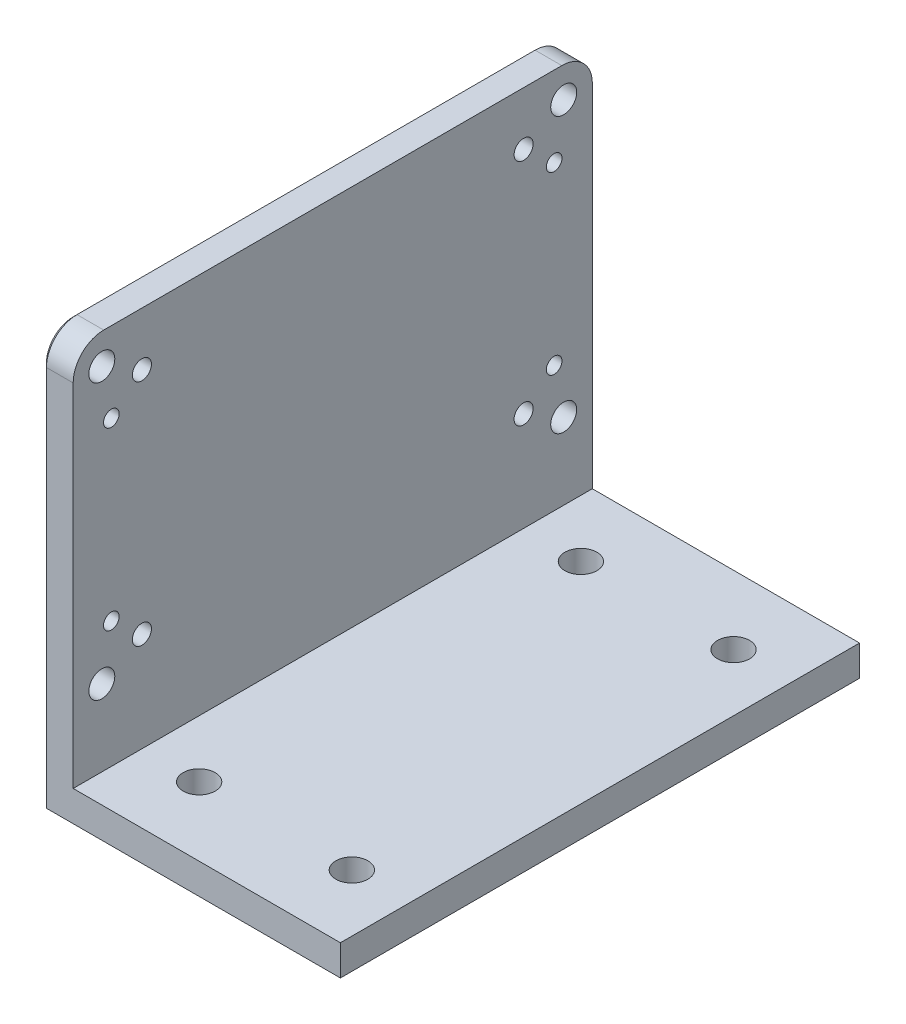
ISO-10303-21;
HEADER;
FILE_DESCRIPTION(('STEP AP214'),'2;1');
FILE_NAME('part.step','',(''),(''),'','','');
FILE_SCHEMA(('AUTOMOTIVE_DESIGN { 1 0 10303 214 1 1 1 1 }'));
ENDSEC;
DATA;
#1=APPLICATION_CONTEXT('core data for automotive mechanical design processes');
#2=APPLICATION_PROTOCOL_DEFINITION('international standard','automotive_design',2000,#1);
#3=PRODUCT_CONTEXT('',#1,'mechanical');
#4=PRODUCT('Part','Part','',(#3));
#5=PRODUCT_RELATED_PRODUCT_CATEGORY('part','',(#4));
#6=PRODUCT_DEFINITION_FORMATION('','',#4);
#7=PRODUCT_DEFINITION_CONTEXT('part definition',#1,'design');
#8=PRODUCT_DEFINITION('design','',#6,#7);
#9=PRODUCT_DEFINITION_SHAPE('','',#8);
#10=(LENGTH_UNIT() NAMED_UNIT(*) SI_UNIT(.MILLI.,.METRE.));
#11=(NAMED_UNIT(*) PLANE_ANGLE_UNIT() SI_UNIT($,.RADIAN.));
#12=(NAMED_UNIT(*) SI_UNIT($,.STERADIAN.) SOLID_ANGLE_UNIT());
#13=UNCERTAINTY_MEASURE_WITH_UNIT(LENGTH_MEASURE(1.E-05),#10,'distance_accuracy_value','');
#14=(GEOMETRIC_REPRESENTATION_CONTEXT(3) GLOBAL_UNCERTAINTY_ASSIGNED_CONTEXT((#13)) GLOBAL_UNIT_ASSIGNED_CONTEXT((#10,
#11,#12)) REPRESENTATION_CONTEXT('',''));
#15=CARTESIAN_POINT('',(0.,0.,0.));
#16=DIRECTION('',(0.,0.,1.));
#17=DIRECTION('',(1.,0.,0.));
#18=AXIS2_PLACEMENT_3D('',#15,#16,#17);
#19=CARTESIAN_POINT('',(0.,54.,68.));
#20=DIRECTION('',(1.,0.,0.));
#21=DIRECTION('',(0.,1.,0.));
#22=AXIS2_PLACEMENT_3D('',#19,#20,#21);
#23=PLANE('',#22);
#24=CARTESIAN_POINT('',(0.,17.,9.00000000000001));
#25=DIRECTION('',(-1.,0.,0.));
#26=DIRECTION('',(0.,0.,1.));
#27=AXIS2_PLACEMENT_3D('',#24,#25,#26);
#28=CIRCLE('',#27,1.25);
#29=CARTESIAN_POINT('',(0.,17.,10.25));
#30=VERTEX_POINT('',#29);
#31=EDGE_CURVE('E659',#30,#30,#28,.T.);
#32=ORIENTED_EDGE('',*,*,#31,.F.);
#33=EDGE_LOOP('',(#32));
#34=FACE_BOUND('',#33,.T.);
#35=CARTESIAN_POINT('',(0.,47.,9.00000000000001));
#36=DIRECTION('',(-1.,0.,0.));
#37=DIRECTION('',(0.,0.,1.));
#38=AXIS2_PLACEMENT_3D('',#35,#36,#37);
#39=CIRCLE('',#38,1.25);
#40=CARTESIAN_POINT('',(0.,47.,10.25));
#41=VERTEX_POINT('',#40);
#42=EDGE_CURVE('E663',#41,#41,#39,.T.);
#43=ORIENTED_EDGE('',*,*,#42,.F.);
#44=EDGE_LOOP('',(#43));
#45=FACE_BOUND('',#44,.T.);
#46=CARTESIAN_POINT('',(0.,47.,59.));
#47=DIRECTION('',(-1.,0.,0.));
#48=DIRECTION('',(0.,0.,1.));
#49=AXIS2_PLACEMENT_3D('',#46,#47,#48);
#50=CIRCLE('',#49,1.25);
#51=CARTESIAN_POINT('',(0.,47.,60.25));
#52=VERTEX_POINT('',#51);
#53=EDGE_CURVE('E227',#52,#52,#50,.T.);
#54=ORIENTED_EDGE('',*,*,#53,.F.);
#55=EDGE_LOOP('',(#54));
#56=FACE_BOUND('',#55,.T.);
#57=CARTESIAN_POINT('',(0.,17.,59.));
#58=DIRECTION('',(-1.,0.,0.));
#59=DIRECTION('',(0.,0.,1.));
#60=AXIS2_PLACEMENT_3D('',#57,#58,#59);
#61=CIRCLE('',#60,1.25);
#62=CARTESIAN_POINT('',(0.,17.,60.25));
#63=VERTEX_POINT('',#62);
#64=EDGE_CURVE('E216',#63,#63,#61,.T.);
#65=ORIENTED_EDGE('',*,*,#64,.F.);
#66=EDGE_LOOP('',(#65));
#67=FACE_BOUND('',#66,.T.);
#68=CARTESIAN_POINT('',(0.,43.5,5.00000000000001));
#69=DIRECTION('',(-1.,0.,0.));
#70=DIRECTION('',(0.,0.,1.));
#71=AXIS2_PLACEMENT_3D('',#68,#69,#70);
#72=CIRCLE('',#71,1.025);
#73=CARTESIAN_POINT('',(0.,43.5,6.02500000000001));
#74=VERTEX_POINT('',#73);
#75=EDGE_CURVE('E215',#74,#74,#72,.T.);
#76=ORIENTED_EDGE('',*,*,#75,.F.);
#77=EDGE_LOOP('',(#76));
#78=FACE_BOUND('',#77,.T.);
#79=CARTESIAN_POINT('',(0.,43.5,63.));
#80=DIRECTION('',(-1.,0.,0.));
#81=DIRECTION('',(0.,0.,1.));
#82=AXIS2_PLACEMENT_3D('',#79,#80,#81);
#83=CIRCLE('',#82,1.025);
#84=CARTESIAN_POINT('',(0.,43.5,64.025));
#85=VERTEX_POINT('',#84);
#86=EDGE_CURVE('E233',#85,#85,#83,.T.);
#87=ORIENTED_EDGE('',*,*,#86,.F.);
#88=EDGE_LOOP('',(#87));
#89=FACE_BOUND('',#88,.T.);
#90=CARTESIAN_POINT('',(0.,20.5,63.));
#91=DIRECTION('',(-1.,0.,0.));
#92=DIRECTION('',(0.,0.,1.));
#93=AXIS2_PLACEMENT_3D('',#90,#91,#92);
#94=CIRCLE('',#93,1.025);
#95=CARTESIAN_POINT('',(0.,20.5,64.025));
#96=VERTEX_POINT('',#95);
#97=EDGE_CURVE('E239',#96,#96,#94,.T.);
#98=ORIENTED_EDGE('',*,*,#97,.F.);
#99=EDGE_LOOP('',(#98));
#100=FACE_BOUND('',#99,.T.);
#101=CARTESIAN_POINT('',(0.,20.5,5.00000000000001));
#102=DIRECTION('',(-1.,0.,0.));
#103=DIRECTION('',(0.,0.,1.));
#104=AXIS2_PLACEMENT_3D('',#101,#102,#103);
#105=CIRCLE('',#104,1.025);
#106=CARTESIAN_POINT('',(0.,20.5,6.02500000000001));
#107=VERTEX_POINT('',#106);
#108=EDGE_CURVE('E245',#107,#107,#105,.T.);
#109=ORIENTED_EDGE('',*,*,#108,.F.);
#110=EDGE_LOOP('',(#109));
#111=FACE_BOUND('',#110,.T.);
#112=CARTESIAN_POINT('',(0.,50.,64.25));
#113=DIRECTION('',(1.,0.,0.));
#114=DIRECTION('',(0.,1.,0.));
#115=AXIS2_PLACEMENT_3D('',#112,#113,#114);
#116=CIRCLE('',#115,1.7);
#117=CARTESIAN_POINT('',(0.,51.7,64.25));
#118=VERTEX_POINT('',#117);
#119=EDGE_CURVE('E276',#118,#118,#116,.T.);
#120=ORIENTED_EDGE('',*,*,#119,.T.);
#121=EDGE_LOOP('',(#120));
#122=FACE_BOUND('',#121,.T.);
#123=CARTESIAN_POINT('',(0.,50.,3.75));
#124=DIRECTION('',(1.,0.,0.));
#125=DIRECTION('',(0.,1.,0.));
#126=AXIS2_PLACEMENT_3D('',#123,#124,#125);
#127=CIRCLE('',#126,1.7);
#128=CARTESIAN_POINT('',(0.,51.7,3.75));
#129=VERTEX_POINT('',#128);
#130=EDGE_CURVE('E282',#129,#129,#127,.T.);
#131=ORIENTED_EDGE('',*,*,#130,.T.);
#132=EDGE_LOOP('',(#131));
#133=FACE_BOUND('',#132,.T.);
#134=CARTESIAN_POINT('',(0.,14.,3.75));
#135=DIRECTION('',(1.,0.,0.));
#136=DIRECTION('',(0.,1.,0.));
#137=AXIS2_PLACEMENT_3D('',#134,#135,#136);
#138=CIRCLE('',#137,1.7);
#139=CARTESIAN_POINT('',(0.,15.7,3.75));
#140=VERTEX_POINT('',#139);
#141=EDGE_CURVE('E288',#140,#140,#138,.T.);
#142=ORIENTED_EDGE('',*,*,#141,.T.);
#143=EDGE_LOOP('',(#142));
#144=FACE_BOUND('',#143,.T.);
#145=CARTESIAN_POINT('',(0.,14.,64.25));
#146=DIRECTION('',(1.,0.,0.));
#147=DIRECTION('',(0.,1.,0.));
#148=AXIS2_PLACEMENT_3D('',#145,#146,#147);
#149=CIRCLE('',#148,1.7);
#150=CARTESIAN_POINT('',(0.,15.7,64.25));
#151=VERTEX_POINT('',#150);
#152=EDGE_CURVE('E154',#151,#151,#149,.T.);
#153=ORIENTED_EDGE('',*,*,#152,.T.);
#154=EDGE_LOOP('',(#153));
#155=FACE_BOUND('',#154,.T.);
#156=DIRECTION('',(0.,0.,-1.));
#157=VECTOR('',#156,1.);
#158=CARTESIAN_POINT('',(0.,0.,68.));
#159=LINE('',#158,#157);
#160=CARTESIAN_POINT('',(0.,0.,67.5));
#161=VERTEX_POINT('',#160);
#162=CARTESIAN_POINT('',(0.,0.,0.499999999999994));
#163=VERTEX_POINT('',#162);
#164=EDGE_CURVE('E137',#161,#163,#159,.T.);
#165=ORIENTED_EDGE('',*,*,#164,.F.);
#166=DIRECTION('',(0.,1.,0.));
#167=VECTOR('',#166,1.);
#168=CARTESIAN_POINT('',(0.,50.,67.5));
#169=LINE('',#168,#167);
#170=CARTESIAN_POINT('',(0.,50.,67.5));
#171=VERTEX_POINT('',#170);
#172=EDGE_CURVE('E193',#161,#171,#169,.T.);
#173=ORIENTED_EDGE('',*,*,#172,.T.);
#174=CARTESIAN_POINT('',(0.,50.,64.));
#175=DIRECTION('',(1.,0.,0.));
#176=DIRECTION('',(0.,1.,0.));
#177=AXIS2_PLACEMENT_3D('',#174,#175,#176);
#178=CIRCLE('',#177,3.50000000000003);
#179=CARTESIAN_POINT('',(0.,53.5,64.));
#180=VERTEX_POINT('',#179);
#181=EDGE_CURVE('E191',#171,#180,#178,.F.);
#182=ORIENTED_EDGE('',*,*,#181,.T.);
#183=DIRECTION('',(0.,0.,-1.));
#184=VECTOR('',#183,1.);
#185=CARTESIAN_POINT('',(0.,53.5,68.));
#186=LINE('',#185,#184);
#187=CARTESIAN_POINT('',(0.,53.5,4.));
#188=VERTEX_POINT('',#187);
#189=EDGE_CURVE('E189',#180,#188,#186,.T.);
#190=ORIENTED_EDGE('',*,*,#189,.T.);
#191=CARTESIAN_POINT('',(0.,50.,4.));
#192=DIRECTION('',(1.,0.,0.));
#193=DIRECTION('',(0.,1.,0.));
#194=AXIS2_PLACEMENT_3D('',#191,#192,#193);
#195=CIRCLE('',#194,3.50000000000003);
#196=CARTESIAN_POINT('',(0.,50.,0.499999999999973));
#197=VERTEX_POINT('',#196);
#198=EDGE_CURVE('E187',#188,#197,#195,.F.);
#199=ORIENTED_EDGE('',*,*,#198,.T.);
#200=DIRECTION('',(0.,-1.,0.));
#201=VECTOR('',#200,1.);
#202=CARTESIAN_POINT('',(0.,54.,0.499999999999973));
#203=LINE('',#202,#201);
#204=EDGE_CURVE('E185',#197,#163,#203,.T.);
#205=ORIENTED_EDGE('',*,*,#204,.T.);
#206=EDGE_LOOP('',(#165,#173,#182,#190,#199,#205));
#207=FACE_BOUND('',#206,.T.);
#208=ADVANCED_FACE('F35',(#34,#45,#56,#67,#78,#89,#100,#111,#122,#133,#144,#155,#207),#23,.F.);
#209=CARTESIAN_POINT('',(0.,0.,68.));
#210=DIRECTION('',(0.,1.,0.));
#211=DIRECTION('',(0.,0.,1.));
#212=AXIS2_PLACEMENT_3D('',#209,#210,#211);
#213=PLANE('',#212);
#214=CARTESIAN_POINT('',(31.5,0.,59.));
#215=DIRECTION('',(0.,1.,0.));
#216=DIRECTION('',(0.,0.,1.));
#217=AXIS2_PLACEMENT_3D('',#214,#215,#216);
#218=CIRCLE('',#217,2.1);
#219=CARTESIAN_POINT('',(31.5,0.,61.1));
#220=VERTEX_POINT('',#219);
#221=EDGE_CURVE('E252',#220,#220,#218,.T.);
#222=ORIENTED_EDGE('',*,*,#221,.T.);
#223=EDGE_LOOP('',(#222));
#224=FACE_BOUND('',#223,.T.);
#225=CARTESIAN_POINT('',(11.5,0.,59.));
#226=DIRECTION('',(0.,1.,0.));
#227=DIRECTION('',(0.,0.,1.));
#228=AXIS2_PLACEMENT_3D('',#225,#226,#227);
#229=CIRCLE('',#228,2.1);
#230=CARTESIAN_POINT('',(11.5,0.,61.1));
#231=VERTEX_POINT('',#230);
#232=EDGE_CURVE('E258',#231,#231,#229,.T.);
#233=ORIENTED_EDGE('',*,*,#232,.T.);
#234=EDGE_LOOP('',(#233));
#235=FACE_BOUND('',#234,.T.);
#236=CARTESIAN_POINT('',(11.5,0.,9.));
#237=DIRECTION('',(0.,1.,0.));
#238=DIRECTION('',(0.,0.,1.));
#239=AXIS2_PLACEMENT_3D('',#236,#237,#238);
#240=CIRCLE('',#239,2.1);
#241=CARTESIAN_POINT('',(11.5,0.,11.1));
#242=VERTEX_POINT('',#241);
#243=EDGE_CURVE('E264',#242,#242,#240,.T.);
#244=ORIENTED_EDGE('',*,*,#243,.T.);
#245=EDGE_LOOP('',(#244));
#246=FACE_BOUND('',#245,.T.);
#247=CARTESIAN_POINT('',(31.5,0.,9.));
#248=DIRECTION('',(0.,1.,0.));
#249=DIRECTION('',(0.,0.,1.));
#250=AXIS2_PLACEMENT_3D('',#247,#248,#249);
#251=CIRCLE('',#250,2.1);
#252=CARTESIAN_POINT('',(31.5,0.,11.1));
#253=VERTEX_POINT('',#252);
#254=EDGE_CURVE('E270',#253,#253,#251,.T.);
#255=ORIENTED_EDGE('',*,*,#254,.T.);
#256=EDGE_LOOP('',(#255));
#257=FACE_BOUND('',#256,.T.);
#258=DIRECTION('',(1.,0.,0.));
#259=VECTOR('',#258,1.);
#260=CARTESIAN_POINT('',(0.,0.,68.));
#261=LINE('',#260,#259);
#262=CARTESIAN_POINT('',(0.499999999999973,0.,68.));
#263=VERTEX_POINT('',#262);
#264=CARTESIAN_POINT('',(39.,0.,68.));
#265=VERTEX_POINT('',#264);
#266=EDGE_CURVE('E119',#263,#265,#261,.T.);
#267=ORIENTED_EDGE('',*,*,#266,.F.);
#268=DIRECTION('',(-0.707106781186548,0.,-0.707106781186548));
#269=VECTOR('',#268,1.);
#270=CARTESIAN_POINT('',(0.499999999999973,0.,68.));
#271=LINE('',#270,#269);
#272=EDGE_CURVE('E183',#263,#161,#271,.T.);
#273=ORIENTED_EDGE('',*,*,#272,.T.);
#274=ORIENTED_EDGE('',*,*,#164,.T.);
#275=DIRECTION('',(-0.707106781186548,0.,0.707106781186548));
#276=VECTOR('',#275,1.);
#277=CARTESIAN_POINT('',(0.,0.,0.499999999999981));
#278=LINE('',#277,#276);
#279=CARTESIAN_POINT('',(0.499999999999973,0.,0.));
#280=VERTEX_POINT('',#279);
#281=EDGE_CURVE('E181',#163,#280,#278,.F.);
#282=ORIENTED_EDGE('',*,*,#281,.T.);
#283=DIRECTION('',(1.,0.,0.));
#284=VECTOR('',#283,1.);
#285=CARTESIAN_POINT('',(0.,0.,0.));
#286=LINE('',#285,#284);
#287=CARTESIAN_POINT('',(39.,0.,0.));
#288=VERTEX_POINT('',#287);
#289=EDGE_CURVE('E134',#280,#288,#286,.T.);
#290=ORIENTED_EDGE('',*,*,#289,.T.);
#291=DIRECTION('',(0.,0.,-1.));
#292=VECTOR('',#291,1.);
#293=CARTESIAN_POINT('',(39.,0.,68.));
#294=LINE('',#293,#292);
#295=EDGE_CURVE('E132',#265,#288,#294,.T.);
#296=ORIENTED_EDGE('',*,*,#295,.F.);
#297=EDGE_LOOP('',(#267,#273,#274,#282,#290,#296));
#298=FACE_BOUND('',#297,.T.);
#299=ADVANCED_FACE('F133',(#224,#235,#246,#257,#298),#213,.F.);
#300=CARTESIAN_POINT('',(39.,0.,68.));
#301=DIRECTION('',(-1.,0.,0.));
#302=DIRECTION('',(0.,0.,1.));
#303=AXIS2_PLACEMENT_3D('',#300,#301,#302);
#304=PLANE('',#303);
#305=DIRECTION('',(0.,1.,0.));
#306=VECTOR('',#305,1.);
#307=CARTESIAN_POINT('',(39.,0.,0.));
#308=LINE('',#307,#306);
#309=CARTESIAN_POINT('',(39.,3.99999999999999,0.));
#310=VERTEX_POINT('',#309);
#311=EDGE_CURVE('E153',#288,#310,#308,.T.);
#312=ORIENTED_EDGE('',*,*,#311,.T.);
#313=DIRECTION('',(0.,0.,-1.));
#314=VECTOR('',#313,1.);
#315=CARTESIAN_POINT('',(39.,3.99999999999999,68.));
#316=LINE('',#315,#314);
#317=CARTESIAN_POINT('',(39.,3.99999999999999,68.));
#318=VERTEX_POINT('',#317);
#319=EDGE_CURVE('E138',#318,#310,#316,.T.);
#320=ORIENTED_EDGE('',*,*,#319,.F.);
#321=DIRECTION('',(0.,1.,0.));
#322=VECTOR('',#321,1.);
#323=CARTESIAN_POINT('',(39.,0.,68.));
#324=LINE('',#323,#322);
#325=EDGE_CURVE('E124',#265,#318,#324,.T.);
#326=ORIENTED_EDGE('',*,*,#325,.F.);
#327=ORIENTED_EDGE('',*,*,#295,.T.);
#328=EDGE_LOOP('',(#312,#320,#326,#327));
#329=FACE_BOUND('',#328,.T.);
#330=ADVANCED_FACE('F140',(#329),#304,.F.);
#331=CARTESIAN_POINT('',(39.,3.99999999999999,68.));
#332=DIRECTION('',(0.,-1.,0.));
#333=DIRECTION('',(1.,0.,0.));
#334=AXIS2_PLACEMENT_3D('',#331,#332,#333);
#335=PLANE('',#334);
#336=CARTESIAN_POINT('',(31.5,3.99999999999999,59.));
#337=DIRECTION('',(0.,1.,0.));
#338=DIRECTION('',(0.,0.,1.));
#339=AXIS2_PLACEMENT_3D('',#336,#337,#338);
#340=CIRCLE('',#339,2.1);
#341=CARTESIAN_POINT('',(31.5,3.99999999999999,61.1));
#342=VERTEX_POINT('',#341);
#343=EDGE_CURVE('E212',#342,#342,#340,.T.);
#344=ORIENTED_EDGE('',*,*,#343,.F.);
#345=EDGE_LOOP('',(#344));
#346=FACE_BOUND('',#345,.T.);
#347=CARTESIAN_POINT('',(11.5,3.99999999999999,59.));
#348=DIRECTION('',(0.,1.,0.));
#349=DIRECTION('',(0.,0.,1.));
#350=AXIS2_PLACEMENT_3D('',#347,#348,#349);
#351=CIRCLE('',#350,2.1);
#352=CARTESIAN_POINT('',(11.5,3.99999999999999,61.1));
#353=VERTEX_POINT('',#352);
#354=EDGE_CURVE('E255',#353,#353,#351,.T.);
#355=ORIENTED_EDGE('',*,*,#354,.F.);
#356=EDGE_LOOP('',(#355));
#357=FACE_BOUND('',#356,.T.);
#358=CARTESIAN_POINT('',(11.5,3.99999999999999,9.));
#359=DIRECTION('',(0.,1.,0.));
#360=DIRECTION('',(0.,0.,1.));
#361=AXIS2_PLACEMENT_3D('',#358,#359,#360);
#362=CIRCLE('',#361,2.1);
#363=CARTESIAN_POINT('',(11.5,3.99999999999999,11.1));
#364=VERTEX_POINT('',#363);
#365=EDGE_CURVE('E261',#364,#364,#362,.T.);
#366=ORIENTED_EDGE('',*,*,#365,.F.);
#367=EDGE_LOOP('',(#366));
#368=FACE_BOUND('',#367,.T.);
#369=CARTESIAN_POINT('',(31.5,3.99999999999999,9.));
#370=DIRECTION('',(0.,1.,0.));
#371=DIRECTION('',(0.,0.,1.));
#372=AXIS2_PLACEMENT_3D('',#369,#370,#371);
#373=CIRCLE('',#372,2.1);
#374=CARTESIAN_POINT('',(31.5,3.99999999999999,11.1));
#375=VERTEX_POINT('',#374);
#376=EDGE_CURVE('E267',#375,#375,#373,.T.);
#377=ORIENTED_EDGE('',*,*,#376,.F.);
#378=EDGE_LOOP('',(#377));
#379=FACE_BOUND('',#378,.T.);
#380=DIRECTION('',(-1.,0.,0.));
#381=VECTOR('',#380,1.);
#382=CARTESIAN_POINT('',(39.,3.99999999999999,0.));
#383=LINE('',#382,#381);
#384=CARTESIAN_POINT('',(3.99999999999999,3.99999999999999,0.));
#385=VERTEX_POINT('',#384);
#386=EDGE_CURVE('E156',#310,#385,#383,.T.);
#387=ORIENTED_EDGE('',*,*,#386,.T.);
#388=DIRECTION('',(0.,0.,-1.));
#389=VECTOR('',#388,1.);
#390=CARTESIAN_POINT('',(3.99999999999999,3.99999999999999,68.));
#391=LINE('',#390,#389);
#392=CARTESIAN_POINT('',(3.99999999999999,3.99999999999999,68.));
#393=VERTEX_POINT('',#392);
#394=EDGE_CURVE('E162',#393,#385,#391,.T.);
#395=ORIENTED_EDGE('',*,*,#394,.F.);
#396=DIRECTION('',(-1.,0.,0.));
#397=VECTOR('',#396,1.);
#398=CARTESIAN_POINT('',(39.,3.99999999999999,68.));
#399=LINE('',#398,#397);
#400=EDGE_CURVE('E143',#318,#393,#399,.T.);
#401=ORIENTED_EDGE('',*,*,#400,.F.);
#402=ORIENTED_EDGE('',*,*,#319,.T.);
#403=EDGE_LOOP('',(#387,#395,#401,#402));
#404=FACE_BOUND('',#403,.T.);
#405=ADVANCED_FACE('F376',(#346,#357,#368,#379,#404),#335,.F.);
#406=CARTESIAN_POINT('',(3.99999999999999,3.99999999999999,68.));
#407=DIRECTION('',(-1.,0.,0.));
#408=DIRECTION('',(0.,-1.,0.));
#409=AXIS2_PLACEMENT_3D('',#406,#407,#408);
#410=PLANE('',#409);
#411=CARTESIAN_POINT('',(3.99999999999999,17.,9.00000000000001));
#412=DIRECTION('',(-1.,0.,0.));
#413=DIRECTION('',(0.,-1.,0.));
#414=AXIS2_PLACEMENT_3D('',#411,#412,#413);
#415=CIRCLE('',#414,1.25);
#416=CARTESIAN_POINT('',(3.99999999999999,15.75,9.00000000000001));
#417=VERTEX_POINT('',#416);
#418=EDGE_CURVE('E662',#417,#417,#415,.T.);
#419=ORIENTED_EDGE('',*,*,#418,.T.);
#420=EDGE_LOOP('',(#419));
#421=FACE_BOUND('',#420,.T.);
#422=CARTESIAN_POINT('',(3.99999999999999,47.,9.00000000000001));
#423=DIRECTION('',(-1.,0.,0.));
#424=DIRECTION('',(0.,-1.,0.));
#425=AXIS2_PLACEMENT_3D('',#422,#423,#424);
#426=CIRCLE('',#425,1.25);
#427=CARTESIAN_POINT('',(3.99999999999999,45.75,9.00000000000001));
#428=VERTEX_POINT('',#427);
#429=EDGE_CURVE('E666',#428,#428,#426,.T.);
#430=ORIENTED_EDGE('',*,*,#429,.T.);
#431=EDGE_LOOP('',(#430));
#432=FACE_BOUND('',#431,.T.);
#433=CARTESIAN_POINT('',(3.99999999999999,47.,59.));
#434=DIRECTION('',(-1.,0.,0.));
#435=DIRECTION('',(0.,-1.,0.));
#436=AXIS2_PLACEMENT_3D('',#433,#434,#435);
#437=CIRCLE('',#436,1.25);
#438=CARTESIAN_POINT('',(3.99999999999999,45.75,59.));
#439=VERTEX_POINT('',#438);
#440=EDGE_CURVE('E39',#439,#439,#437,.T.);
#441=ORIENTED_EDGE('',*,*,#440,.T.);
#442=EDGE_LOOP('',(#441));
#443=FACE_BOUND('',#442,.T.);
#444=CARTESIAN_POINT('',(3.99999999999999,17.,59.));
#445=DIRECTION('',(-1.,0.,0.));
#446=DIRECTION('',(0.,-1.,0.));
#447=AXIS2_PLACEMENT_3D('',#444,#445,#446);
#448=CIRCLE('',#447,1.25);
#449=CARTESIAN_POINT('',(3.99999999999999,15.75,59.));
#450=VERTEX_POINT('',#449);
#451=EDGE_CURVE('E213',#450,#450,#448,.T.);
#452=ORIENTED_EDGE('',*,*,#451,.T.);
#453=EDGE_LOOP('',(#452));
#454=FACE_BOUND('',#453,.T.);
#455=CARTESIAN_POINT('',(3.99999999999999,43.5,5.00000000000001));
#456=DIRECTION('',(-1.,0.,0.));
#457=DIRECTION('',(0.,-1.,0.));
#458=AXIS2_PLACEMENT_3D('',#455,#456,#457);
#459=CIRCLE('',#458,1.025);
#460=CARTESIAN_POINT('',(3.99999999999999,42.475,5.00000000000001));
#461=VERTEX_POINT('',#460);
#462=EDGE_CURVE('E220',#461,#461,#459,.T.);
#463=ORIENTED_EDGE('',*,*,#462,.T.);
#464=EDGE_LOOP('',(#463));
#465=FACE_BOUND('',#464,.T.);
#466=CARTESIAN_POINT('',(3.99999999999999,43.5,63.));
#467=DIRECTION('',(-1.,0.,0.));
#468=DIRECTION('',(0.,-1.,0.));
#469=AXIS2_PLACEMENT_3D('',#466,#467,#468);
#470=CIRCLE('',#469,1.025);
#471=CARTESIAN_POINT('',(3.99999999999999,42.475,63.));
#472=VERTEX_POINT('',#471);
#473=EDGE_CURVE('E236',#472,#472,#470,.T.);
#474=ORIENTED_EDGE('',*,*,#473,.T.);
#475=EDGE_LOOP('',(#474));
#476=FACE_BOUND('',#475,.T.);
#477=CARTESIAN_POINT('',(3.99999999999999,20.5,63.));
#478=DIRECTION('',(-1.,0.,0.));
#479=DIRECTION('',(0.,-1.,0.));
#480=AXIS2_PLACEMENT_3D('',#477,#478,#479);
#481=CIRCLE('',#480,1.025);
#482=CARTESIAN_POINT('',(3.99999999999999,19.475,63.));
#483=VERTEX_POINT('',#482);
#484=EDGE_CURVE('E242',#483,#483,#481,.T.);
#485=ORIENTED_EDGE('',*,*,#484,.T.);
#486=EDGE_LOOP('',(#485));
#487=FACE_BOUND('',#486,.T.);
#488=CARTESIAN_POINT('',(3.99999999999999,20.5,5.00000000000001));
#489=DIRECTION('',(-1.,0.,0.));
#490=DIRECTION('',(0.,-1.,0.));
#491=AXIS2_PLACEMENT_3D('',#488,#489,#490);
#492=CIRCLE('',#491,1.025);
#493=CARTESIAN_POINT('',(3.99999999999999,19.475,5.00000000000001));
#494=VERTEX_POINT('',#493);
#495=EDGE_CURVE('E204',#494,#494,#492,.T.);
#496=ORIENTED_EDGE('',*,*,#495,.T.);
#497=EDGE_LOOP('',(#496));
#498=FACE_BOUND('',#497,.T.);
#499=CARTESIAN_POINT('',(3.99999999999998,50.,64.25));
#500=DIRECTION('',(1.,0.,0.));
#501=DIRECTION('',(0.,0.,-1.));
#502=AXIS2_PLACEMENT_3D('',#499,#500,#501);
#503=CIRCLE('',#502,1.7);
#504=CARTESIAN_POINT('',(3.99999999999998,50.,62.55));
#505=VERTEX_POINT('',#504);
#506=EDGE_CURVE('E273',#505,#505,#503,.T.);
#507=ORIENTED_EDGE('',*,*,#506,.F.);
#508=EDGE_LOOP('',(#507));
#509=FACE_BOUND('',#508,.T.);
#510=CARTESIAN_POINT('',(3.99999999999998,50.,3.75));
#511=DIRECTION('',(1.,0.,0.));
#512=DIRECTION('',(0.,0.,-1.));
#513=AXIS2_PLACEMENT_3D('',#510,#511,#512);
#514=CIRCLE('',#513,1.7);
#515=CARTESIAN_POINT('',(3.99999999999998,50.,2.05));
#516=VERTEX_POINT('',#515);
#517=EDGE_CURVE('E279',#516,#516,#514,.T.);
#518=ORIENTED_EDGE('',*,*,#517,.F.);
#519=EDGE_LOOP('',(#518));
#520=FACE_BOUND('',#519,.T.);
#521=CARTESIAN_POINT('',(3.99999999999999,14.,3.75));
#522=DIRECTION('',(1.,0.,0.));
#523=DIRECTION('',(0.,0.,-1.));
#524=AXIS2_PLACEMENT_3D('',#521,#522,#523);
#525=CIRCLE('',#524,1.7);
#526=CARTESIAN_POINT('',(3.99999999999999,14.,2.05));
#527=VERTEX_POINT('',#526);
#528=EDGE_CURVE('E285',#527,#527,#525,.T.);
#529=ORIENTED_EDGE('',*,*,#528,.F.);
#530=EDGE_LOOP('',(#529));
#531=FACE_BOUND('',#530,.T.);
#532=CARTESIAN_POINT('',(3.99999999999999,14.,64.25));
#533=DIRECTION('',(1.,0.,0.));
#534=DIRECTION('',(0.,0.,-1.));
#535=AXIS2_PLACEMENT_3D('',#532,#533,#534);
#536=CIRCLE('',#535,1.7);
#537=CARTESIAN_POINT('',(3.99999999999999,14.,62.55));
#538=VERTEX_POINT('',#537);
#539=EDGE_CURVE('E291',#538,#538,#536,.T.);
#540=ORIENTED_EDGE('',*,*,#539,.F.);
#541=EDGE_LOOP('',(#540));
#542=FACE_BOUND('',#541,.T.);
#543=DIRECTION('',(0.,0.,-1.));
#544=VECTOR('',#543,1.);
#545=CARTESIAN_POINT('',(3.99999999999998,54.,68.));
#546=LINE('',#545,#544);
#547=CARTESIAN_POINT('',(3.99999999999998,54.,64.));
#548=VERTEX_POINT('',#547);
#549=CARTESIAN_POINT('',(3.99999999999998,54.,4.));
#550=VERTEX_POINT('',#549);
#551=EDGE_CURVE('E151',#548,#550,#546,.T.);
#552=ORIENTED_EDGE('',*,*,#551,.F.);
#553=CARTESIAN_POINT('',(3.99999999999998,50.,64.));
#554=DIRECTION('',(-1.,0.,0.));
#555=DIRECTION('',(0.,-1.,0.));
#556=AXIS2_PLACEMENT_3D('',#553,#554,#555);
#557=CIRCLE('',#556,4.);
#558=CARTESIAN_POINT('',(3.99999999999998,50.,68.));
#559=VERTEX_POINT('',#558);
#560=EDGE_CURVE('E176',#548,#559,#557,.F.);
#561=ORIENTED_EDGE('',*,*,#560,.T.);
#562=DIRECTION('',(0.,1.,0.));
#563=VECTOR('',#562,1.);
#564=CARTESIAN_POINT('',(3.99999999999999,3.99999999999999,68.));
#565=LINE('',#564,#563);
#566=EDGE_CURVE('E145',#393,#559,#565,.T.);
#567=ORIENTED_EDGE('',*,*,#566,.F.);
#568=ORIENTED_EDGE('',*,*,#394,.T.);
#569=DIRECTION('',(0.,1.,0.));
#570=VECTOR('',#569,1.);
#571=CARTESIAN_POINT('',(3.99999999999999,3.99999999999999,0.));
#572=LINE('',#571,#570);
#573=CARTESIAN_POINT('',(3.99999999999998,50.,0.));
#574=VERTEX_POINT('',#573);
#575=EDGE_CURVE('E129',#385,#574,#572,.T.);
#576=ORIENTED_EDGE('',*,*,#575,.T.);
#577=CARTESIAN_POINT('',(3.99999999999998,50.,4.));
#578=DIRECTION('',(-1.,0.,0.));
#579=DIRECTION('',(0.,-1.,0.));
#580=AXIS2_PLACEMENT_3D('',#577,#578,#579);
#581=CIRCLE('',#580,4.);
#582=EDGE_CURVE('E174',#574,#550,#581,.F.);
#583=ORIENTED_EDGE('',*,*,#582,.T.);
#584=EDGE_LOOP('',(#552,#561,#567,#568,#576,#583));
#585=FACE_BOUND('',#584,.T.);
#586=ADVANCED_FACE('F373',(#421,#432,#443,#454,#465,#476,#487,#498,#509,#520,#531,#542,#585),
#410,.F.);
#587=CARTESIAN_POINT('',(3.99999999999998,54.,68.));
#588=DIRECTION('',(0.,-1.,0.));
#589=DIRECTION('',(0.,0.,-1.));
#590=AXIS2_PLACEMENT_3D('',#587,#588,#589);
#591=PLANE('',#590);
#592=DIRECTION('',(-1.,0.,0.));
#593=VECTOR('',#592,1.);
#594=CARTESIAN_POINT('',(3.99999999999998,54.,4.));
#595=LINE('',#594,#593);
#596=CARTESIAN_POINT('',(0.499999999999958,54.,4.));
#597=VERTEX_POINT('',#596);
#598=EDGE_CURVE('E170',#550,#597,#595,.T.);
#599=ORIENTED_EDGE('',*,*,#598,.T.);
#600=DIRECTION('',(0.,0.,1.));
#601=VECTOR('',#600,1.);
#602=CARTESIAN_POINT('',(0.499999999999957,54.,68.));
#603=LINE('',#602,#601);
#604=CARTESIAN_POINT('',(0.499999999999957,54.,64.));
#605=VERTEX_POINT('',#604);
#606=EDGE_CURVE('E197',#597,#605,#603,.T.);
#607=ORIENTED_EDGE('',*,*,#606,.T.);
#608=DIRECTION('',(-1.,0.,0.));
#609=VECTOR('',#608,1.);
#610=CARTESIAN_POINT('',(3.99999999999998,54.,64.));
#611=LINE('',#610,#609);
#612=EDGE_CURVE('E172',#605,#548,#611,.F.);
#613=ORIENTED_EDGE('',*,*,#612,.T.);
#614=ORIENTED_EDGE('',*,*,#551,.T.);
#615=EDGE_LOOP('',(#599,#607,#613,#614));
#616=FACE_BOUND('',#615,.T.);
#617=ADVANCED_FACE('F367',(#616),#591,.F.);
#618=CARTESIAN_POINT('',(0.,0.,68.));
#619=DIRECTION('',(0.,0.,1.));
#620=DIRECTION('',(1.,0.,0.));
#621=AXIS2_PLACEMENT_3D('',#618,#619,#620);
#622=PLANE('',#621);
#623=DIRECTION('',(-1.,0.,0.));
#624=VECTOR('',#623,1.);
#625=CARTESIAN_POINT('',(0.,50.,68.));
#626=LINE('',#625,#624);
#627=CARTESIAN_POINT('',(0.499999999999958,50.,68.));
#628=VERTEX_POINT('',#627);
#629=EDGE_CURVE('E168',#559,#628,#626,.T.);
#630=ORIENTED_EDGE('',*,*,#629,.T.);
#631=DIRECTION('',(0.,-1.,0.));
#632=VECTOR('',#631,1.);
#633=CARTESIAN_POINT('',(0.499999999999973,0.,68.));
#634=LINE('',#633,#632);
#635=EDGE_CURVE('E127',#628,#263,#634,.T.);
#636=ORIENTED_EDGE('',*,*,#635,.T.);
#637=ORIENTED_EDGE('',*,*,#266,.T.);
#638=ORIENTED_EDGE('',*,*,#325,.T.);
#639=ORIENTED_EDGE('',*,*,#400,.T.);
#640=ORIENTED_EDGE('',*,*,#566,.T.);
#641=EDGE_LOOP('',(#630,#636,#637,#638,#639,#640));
#642=FACE_BOUND('',#641,.T.);
#643=ADVANCED_FACE('F122',(#642),#622,.T.);
#644=CARTESIAN_POINT('',(0.,0.,0.));
#645=DIRECTION('',(0.,0.,1.));
#646=DIRECTION('',(1.,0.,0.));
#647=AXIS2_PLACEMENT_3D('',#644,#645,#646);
#648=PLANE('',#647);
#649=ORIENTED_EDGE('',*,*,#289,.F.);
#650=DIRECTION('',(0.,1.,0.));
#651=VECTOR('',#650,1.);
#652=CARTESIAN_POINT('',(0.499999999999973,0.,0.));
#653=LINE('',#652,#651);
#654=CARTESIAN_POINT('',(0.499999999999958,50.,0.));
#655=VERTEX_POINT('',#654);
#656=EDGE_CURVE('E11',#280,#655,#653,.T.);
#657=ORIENTED_EDGE('',*,*,#656,.T.);
#658=DIRECTION('',(-1.,0.,0.));
#659=VECTOR('',#658,1.);
#660=CARTESIAN_POINT('',(0.,50.,0.));
#661=LINE('',#660,#659);
#662=EDGE_CURVE('E178',#655,#574,#661,.F.);
#663=ORIENTED_EDGE('',*,*,#662,.T.);
#664=ORIENTED_EDGE('',*,*,#575,.F.);
#665=ORIENTED_EDGE('',*,*,#386,.F.);
#666=ORIENTED_EDGE('',*,*,#311,.F.);
#667=EDGE_LOOP('',(#649,#657,#663,#664,#665,#666));
#668=FACE_BOUND('',#667,.T.);
#669=ADVANCED_FACE('F301',(#668),#648,.F.);
#670=CARTESIAN_POINT('',(3.99999999999999,14.,64.25));
#671=DIRECTION('',(1.,0.,0.));
#672=DIRECTION('',(0.,0.,-1.));
#673=AXIS2_PLACEMENT_3D('',#670,#671,#672);
#674=CYLINDRICAL_SURFACE('',#673,1.7);
#675=ORIENTED_EDGE('',*,*,#539,.T.);
#676=EDGE_LOOP('',(#675));
#677=FACE_BOUND('',#676,.T.);
#678=ORIENTED_EDGE('',*,*,#152,.F.);
#679=EDGE_LOOP('',(#678));
#680=FACE_BOUND('',#679,.T.);
#681=ADVANCED_FACE('F298',(#677,#680),#674,.F.);
#682=CARTESIAN_POINT('',(3.99999999999999,14.,3.75));
#683=DIRECTION('',(1.,0.,0.));
#684=DIRECTION('',(0.,0.,-1.));
#685=AXIS2_PLACEMENT_3D('',#682,#683,#684);
#686=CYLINDRICAL_SURFACE('',#685,1.7);
#687=ORIENTED_EDGE('',*,*,#528,.T.);
#688=EDGE_LOOP('',(#687));
#689=FACE_BOUND('',#688,.T.);
#690=ORIENTED_EDGE('',*,*,#141,.F.);
#691=EDGE_LOOP('',(#690));
#692=FACE_BOUND('',#691,.T.);
#693=ADVANCED_FACE('F300',(#689,#692),#686,.F.);
#694=CARTESIAN_POINT('',(3.99999999999998,50.,3.75));
#695=DIRECTION('',(1.,0.,0.));
#696=DIRECTION('',(0.,0.,-1.));
#697=AXIS2_PLACEMENT_3D('',#694,#695,#696);
#698=CYLINDRICAL_SURFACE('',#697,1.7);
#699=ORIENTED_EDGE('',*,*,#517,.T.);
#700=EDGE_LOOP('',(#699));
#701=FACE_BOUND('',#700,.T.);
#702=ORIENTED_EDGE('',*,*,#130,.F.);
#703=EDGE_LOOP('',(#702));
#704=FACE_BOUND('',#703,.T.);
#705=ADVANCED_FACE('F308',(#701,#704),#698,.F.);
#706=CARTESIAN_POINT('',(3.99999999999998,50.,64.25));
#707=DIRECTION('',(1.,0.,0.));
#708=DIRECTION('',(0.,0.,-1.));
#709=AXIS2_PLACEMENT_3D('',#706,#707,#708);
#710=CYLINDRICAL_SURFACE('',#709,1.7);
#711=ORIENTED_EDGE('',*,*,#506,.T.);
#712=EDGE_LOOP('',(#711));
#713=FACE_BOUND('',#712,.T.);
#714=ORIENTED_EDGE('',*,*,#119,.F.);
#715=EDGE_LOOP('',(#714));
#716=FACE_BOUND('',#715,.T.);
#717=ADVANCED_FACE('F556',(#713,#716),#710,.F.);
#718=CARTESIAN_POINT('',(31.5,3.99999999999999,9.));
#719=DIRECTION('',(0.,1.,0.));
#720=DIRECTION('',(0.,0.,1.));
#721=AXIS2_PLACEMENT_3D('',#718,#719,#720);
#722=CYLINDRICAL_SURFACE('',#721,2.1);
#723=ORIENTED_EDGE('',*,*,#376,.T.);
#724=EDGE_LOOP('',(#723));
#725=FACE_BOUND('',#724,.T.);
#726=ORIENTED_EDGE('',*,*,#254,.F.);
#727=EDGE_LOOP('',(#726));
#728=FACE_BOUND('',#727,.T.);
#729=ADVANCED_FACE('F552',(#725,#728),#722,.F.);
#730=CARTESIAN_POINT('',(11.5,3.99999999999999,9.));
#731=DIRECTION('',(0.,1.,0.));
#732=DIRECTION('',(0.,0.,1.));
#733=AXIS2_PLACEMENT_3D('',#730,#731,#732);
#734=CYLINDRICAL_SURFACE('',#733,2.1);
#735=ORIENTED_EDGE('',*,*,#365,.T.);
#736=EDGE_LOOP('',(#735));
#737=FACE_BOUND('',#736,.T.);
#738=ORIENTED_EDGE('',*,*,#243,.F.);
#739=EDGE_LOOP('',(#738));
#740=FACE_BOUND('',#739,.T.);
#741=ADVANCED_FACE('F548',(#737,#740),#734,.F.);
#742=CARTESIAN_POINT('',(11.5,3.99999999999999,59.));
#743=DIRECTION('',(0.,1.,0.));
#744=DIRECTION('',(0.,0.,1.));
#745=AXIS2_PLACEMENT_3D('',#742,#743,#744);
#746=CYLINDRICAL_SURFACE('',#745,2.1);
#747=ORIENTED_EDGE('',*,*,#354,.T.);
#748=EDGE_LOOP('',(#747));
#749=FACE_BOUND('',#748,.T.);
#750=ORIENTED_EDGE('',*,*,#232,.F.);
#751=EDGE_LOOP('',(#750));
#752=FACE_BOUND('',#751,.T.);
#753=ADVANCED_FACE('F544',(#749,#752),#746,.F.);
#754=CARTESIAN_POINT('',(31.5,3.99999999999999,59.));
#755=DIRECTION('',(0.,1.,0.));
#756=DIRECTION('',(0.,0.,1.));
#757=AXIS2_PLACEMENT_3D('',#754,#755,#756);
#758=CYLINDRICAL_SURFACE('',#757,2.1);
#759=ORIENTED_EDGE('',*,*,#343,.T.);
#760=EDGE_LOOP('',(#759));
#761=FACE_BOUND('',#760,.T.);
#762=ORIENTED_EDGE('',*,*,#221,.F.);
#763=EDGE_LOOP('',(#762));
#764=FACE_BOUND('',#763,.T.);
#765=ADVANCED_FACE('F329',(#761,#764),#758,.F.);
#766=CARTESIAN_POINT('',(0.,50.,64.));
#767=DIRECTION('',(1.,0.,0.));
#768=DIRECTION('',(0.,0.,-1.));
#769=AXIS2_PLACEMENT_3D('',#766,#767,#768);
#770=CYLINDRICAL_SURFACE('',#769,4.);
#771=ORIENTED_EDGE('',*,*,#612,.F.);
#772=CARTESIAN_POINT('',(0.499999999999958,50.,64.));
#773=DIRECTION('',(1.,0.,0.));
#774=DIRECTION('',(0.,0.,-1.));
#775=AXIS2_PLACEMENT_3D('',#772,#773,#774);
#776=CIRCLE('',#775,4.);
#777=EDGE_CURVE('E195',#605,#628,#776,.T.);
#778=ORIENTED_EDGE('',*,*,#777,.T.);
#779=ORIENTED_EDGE('',*,*,#629,.F.);
#780=ORIENTED_EDGE('',*,*,#560,.F.);
#781=EDGE_LOOP('',(#771,#778,#779,#780));
#782=FACE_BOUND('',#781,.T.);
#783=ADVANCED_FACE('F325',(#782),#770,.T.);
#784=CARTESIAN_POINT('',(3.99999999999998,50.,4.));
#785=DIRECTION('',(-1.,0.,0.));
#786=DIRECTION('',(0.,0.,1.));
#787=AXIS2_PLACEMENT_3D('',#784,#785,#786);
#788=CYLINDRICAL_SURFACE('',#787,4.);
#789=ORIENTED_EDGE('',*,*,#662,.F.);
#790=CARTESIAN_POINT('',(0.499999999999958,50.,4.));
#791=DIRECTION('',(1.,0.,0.));
#792=DIRECTION('',(0.,0.,-1.));
#793=AXIS2_PLACEMENT_3D('',#790,#791,#792);
#794=CIRCLE('',#793,4.);
#795=EDGE_CURVE('E44',#655,#597,#794,.T.);
#796=ORIENTED_EDGE('',*,*,#795,.T.);
#797=ORIENTED_EDGE('',*,*,#598,.F.);
#798=ORIENTED_EDGE('',*,*,#582,.F.);
#799=EDGE_LOOP('',(#789,#796,#797,#798));
#800=FACE_BOUND('',#799,.T.);
#801=ADVANCED_FACE('F328',(#800),#788,.T.);
#802=CARTESIAN_POINT('',(0.,54.,0.499999999999973));
#803=DIRECTION('',(0.707106781186547,0.,0.707106781186547));
#804=DIRECTION('',(0.,-1.,0.));
#805=AXIS2_PLACEMENT_3D('',#802,#803,#804);
#806=PLANE('',#805);
#807=ORIENTED_EDGE('',*,*,#281,.F.);
#808=ORIENTED_EDGE('',*,*,#204,.F.);
#809=DIRECTION('',(-0.707106781186547,0.,0.707106781186547));
#810=VECTOR('',#809,1.);
#811=CARTESIAN_POINT('',(0.499999999999958,50.,0.));
#812=LINE('',#811,#810);
#813=EDGE_CURVE('E210',#655,#197,#812,.T.);
#814=ORIENTED_EDGE('',*,*,#813,.F.);
#815=ORIENTED_EDGE('',*,*,#656,.F.);
#816=EDGE_LOOP('',(#807,#808,#814,#815));
#817=FACE_BOUND('',#816,.T.);
#818=ADVANCED_FACE('F37',(#817),#806,.F.);
#819=CARTESIAN_POINT('',(0.,50.,4.));
#820=DIRECTION('',(1.,0.,0.));
#821=DIRECTION('',(0.,0.,-1.));
#822=AXIS2_PLACEMENT_3D('',#819,#820,#821);
#823=CONICAL_SURFACE('',#822,3.50000000000003,0.785398163397447);
#824=ORIENTED_EDGE('',*,*,#813,.T.);
#825=ORIENTED_EDGE('',*,*,#198,.F.);
#826=DIRECTION('',(-0.707106781186549,-0.707106781186547,0.));
#827=VECTOR('',#826,1.);
#828=CARTESIAN_POINT('',(0.499999999999958,54.,4.));
#829=LINE('',#828,#827);
#830=EDGE_CURVE('E207',#597,#188,#829,.T.);
#831=ORIENTED_EDGE('',*,*,#830,.F.);
#832=ORIENTED_EDGE('',*,*,#795,.F.);
#833=EDGE_LOOP('',(#824,#825,#831,#832));
#834=FACE_BOUND('',#833,.T.);
#835=ADVANCED_FACE('F344',(#834),#823,.T.);
#836=CARTESIAN_POINT('',(0.,53.5,68.));
#837=DIRECTION('',(0.707106781186547,-0.707106781186547,0.));
#838=DIRECTION('',(0.,0.,-1.));
#839=AXIS2_PLACEMENT_3D('',#836,#837,#838);
#840=PLANE('',#839);
#841=ORIENTED_EDGE('',*,*,#830,.T.);
#842=ORIENTED_EDGE('',*,*,#189,.F.);
#843=DIRECTION('',(-0.707106781186547,-0.707106781186547,0.));
#844=VECTOR('',#843,1.);
#845=CARTESIAN_POINT('',(0.499999999999957,54.,64.));
#846=LINE('',#845,#844);
#847=EDGE_CURVE('E203',#605,#180,#846,.T.);
#848=ORIENTED_EDGE('',*,*,#847,.F.);
#849=ORIENTED_EDGE('',*,*,#606,.F.);
#850=EDGE_LOOP('',(#841,#842,#848,#849));
#851=FACE_BOUND('',#850,.T.);
#852=ADVANCED_FACE('F341',(#851),#840,.F.);
#853=CARTESIAN_POINT('',(0.,50.,64.));
#854=DIRECTION('',(1.,0.,0.));
#855=DIRECTION('',(0.,0.,-1.));
#856=AXIS2_PLACEMENT_3D('',#853,#854,#855);
#857=CONICAL_SURFACE('',#856,3.50000000000003,0.785398163397445);
#858=ORIENTED_EDGE('',*,*,#847,.T.);
#859=ORIENTED_EDGE('',*,*,#181,.F.);
#860=DIRECTION('',(-0.707106781186548,0.,-0.707106781186547));
#861=VECTOR('',#860,1.);
#862=CARTESIAN_POINT('',(0.499999999999958,50.,68.));
#863=LINE('',#862,#861);
#864=EDGE_CURVE('E200',#628,#171,#863,.T.);
#865=ORIENTED_EDGE('',*,*,#864,.F.);
#866=ORIENTED_EDGE('',*,*,#777,.F.);
#867=EDGE_LOOP('',(#858,#859,#865,#866));
#868=FACE_BOUND('',#867,.T.);
#869=ADVANCED_FACE('F337',(#868),#857,.T.);
#870=CARTESIAN_POINT('',(0.499999999999973,0.,68.));
#871=DIRECTION('',(-0.707106781186547,0.,0.707106781186547));
#872=DIRECTION('',(0.,1.,0.));
#873=AXIS2_PLACEMENT_3D('',#870,#871,#872);
#874=PLANE('',#873);
#875=ORIENTED_EDGE('',*,*,#864,.T.);
#876=ORIENTED_EDGE('',*,*,#172,.F.);
#877=ORIENTED_EDGE('',*,*,#272,.F.);
#878=ORIENTED_EDGE('',*,*,#635,.F.);
#879=EDGE_LOOP('',(#875,#876,#877,#878));
#880=FACE_BOUND('',#879,.T.);
#881=ADVANCED_FACE('F333',(#880),#874,.T.);
#882=CARTESIAN_POINT('',(0.,20.5,5.00000000000001));
#883=DIRECTION('',(-1.,0.,0.));
#884=DIRECTION('',(0.,0.,1.));
#885=AXIS2_PLACEMENT_3D('',#882,#883,#884);
#886=CYLINDRICAL_SURFACE('',#885,1.025);
#887=ORIENTED_EDGE('',*,*,#108,.T.);
#888=EDGE_LOOP('',(#887));
#889=FACE_BOUND('',#888,.T.);
#890=ORIENTED_EDGE('',*,*,#495,.F.);
#891=EDGE_LOOP('',(#890));
#892=FACE_BOUND('',#891,.T.);
#893=ADVANCED_FACE('F336',(#889,#892),#886,.F.);
#894=CARTESIAN_POINT('',(0.,20.5,63.));
#895=DIRECTION('',(-1.,0.,0.));
#896=DIRECTION('',(0.,0.,1.));
#897=AXIS2_PLACEMENT_3D('',#894,#895,#896);
#898=CYLINDRICAL_SURFACE('',#897,1.025);
#899=ORIENTED_EDGE('',*,*,#97,.T.);
#900=EDGE_LOOP('',(#899));
#901=FACE_BOUND('',#900,.T.);
#902=ORIENTED_EDGE('',*,*,#484,.F.);
#903=EDGE_LOOP('',(#902));
#904=FACE_BOUND('',#903,.T.);
#905=ADVANCED_FACE('F454',(#901,#904),#898,.F.);
#906=CARTESIAN_POINT('',(0.,43.5,63.));
#907=DIRECTION('',(-1.,0.,0.));
#908=DIRECTION('',(0.,0.,1.));
#909=AXIS2_PLACEMENT_3D('',#906,#907,#908);
#910=CYLINDRICAL_SURFACE('',#909,1.025);
#911=ORIENTED_EDGE('',*,*,#86,.T.);
#912=EDGE_LOOP('',(#911));
#913=FACE_BOUND('',#912,.T.);
#914=ORIENTED_EDGE('',*,*,#473,.F.);
#915=EDGE_LOOP('',(#914));
#916=FACE_BOUND('',#915,.T.);
#917=ADVANCED_FACE('F464',(#913,#916),#910,.F.);
#918=CARTESIAN_POINT('',(0.,43.5,5.00000000000001));
#919=DIRECTION('',(-1.,0.,0.));
#920=DIRECTION('',(0.,0.,1.));
#921=AXIS2_PLACEMENT_3D('',#918,#919,#920);
#922=CYLINDRICAL_SURFACE('',#921,1.025);
#923=ORIENTED_EDGE('',*,*,#75,.T.);
#924=EDGE_LOOP('',(#923));
#925=FACE_BOUND('',#924,.T.);
#926=ORIENTED_EDGE('',*,*,#462,.F.);
#927=EDGE_LOOP('',(#926));
#928=FACE_BOUND('',#927,.T.);
#929=ADVANCED_FACE('F474',(#925,#928),#922,.F.);
#930=CARTESIAN_POINT('',(0.,17.,59.));
#931=DIRECTION('',(-1.,0.,0.));
#932=DIRECTION('',(0.,0.,1.));
#933=AXIS2_PLACEMENT_3D('',#930,#931,#932);
#934=CYLINDRICAL_SURFACE('',#933,1.25);
#935=ORIENTED_EDGE('',*,*,#64,.T.);
#936=EDGE_LOOP('',(#935));
#937=FACE_BOUND('',#936,.T.);
#938=ORIENTED_EDGE('',*,*,#451,.F.);
#939=EDGE_LOOP('',(#938));
#940=FACE_BOUND('',#939,.T.);
#941=ADVANCED_FACE('F483',(#937,#940),#934,.F.);
#942=CARTESIAN_POINT('',(0.,47.,59.));
#943=DIRECTION('',(-1.,0.,0.));
#944=DIRECTION('',(0.,0.,1.));
#945=AXIS2_PLACEMENT_3D('',#942,#943,#944);
#946=CYLINDRICAL_SURFACE('',#945,1.25);
#947=ORIENTED_EDGE('',*,*,#53,.T.);
#948=EDGE_LOOP('',(#947));
#949=FACE_BOUND('',#948,.T.);
#950=ORIENTED_EDGE('',*,*,#440,.F.);
#951=EDGE_LOOP('',(#950));
#952=FACE_BOUND('',#951,.T.);
#953=ADVANCED_FACE('F507',(#949,#952),#946,.F.);
#954=CARTESIAN_POINT('',(0.,47.,9.00000000000001));
#955=DIRECTION('',(-1.,0.,0.));
#956=DIRECTION('',(0.,0.,1.));
#957=AXIS2_PLACEMENT_3D('',#954,#955,#956);
#958=CYLINDRICAL_SURFACE('',#957,1.25);
#959=ORIENTED_EDGE('',*,*,#42,.T.);
#960=EDGE_LOOP('',(#959));
#961=FACE_BOUND('',#960,.T.);
#962=ORIENTED_EDGE('',*,*,#429,.F.);
#963=EDGE_LOOP('',(#962));
#964=FACE_BOUND('',#963,.T.);
#965=ADVANCED_FACE('F516',(#961,#964),#958,.F.);
#966=CARTESIAN_POINT('',(0.,17.,9.00000000000001));
#967=DIRECTION('',(-1.,0.,0.));
#968=DIRECTION('',(0.,0.,1.));
#969=AXIS2_PLACEMENT_3D('',#966,#967,#968);
#970=CYLINDRICAL_SURFACE('',#969,1.25);
#971=ORIENTED_EDGE('',*,*,#31,.T.);
#972=EDGE_LOOP('',(#971));
#973=FACE_BOUND('',#972,.T.);
#974=ORIENTED_EDGE('',*,*,#418,.F.);
#975=EDGE_LOOP('',(#974));
#976=FACE_BOUND('',#975,.T.);
#977=ADVANCED_FACE('F526',(#973,#976),#970,.F.);
#978=CLOSED_SHELL('',(#208,#299,#330,#405,#586,#617,#643,#669,#681,#693,#705,#717,#729,#741,
#753,#765,#783,#801,#818,#835,#852,#869,#881,#893,#905,#917,#929,#941,#953,#965,#977));
#979=MANIFOLD_SOLID_BREP('B2',#978);
#980=ADVANCED_BREP_SHAPE_REPRESENTATION('',(#18,#979),#14);
#981=SHAPE_DEFINITION_REPRESENTATION(#9,#980);
ENDSEC;
END-ISO-10303-21;
